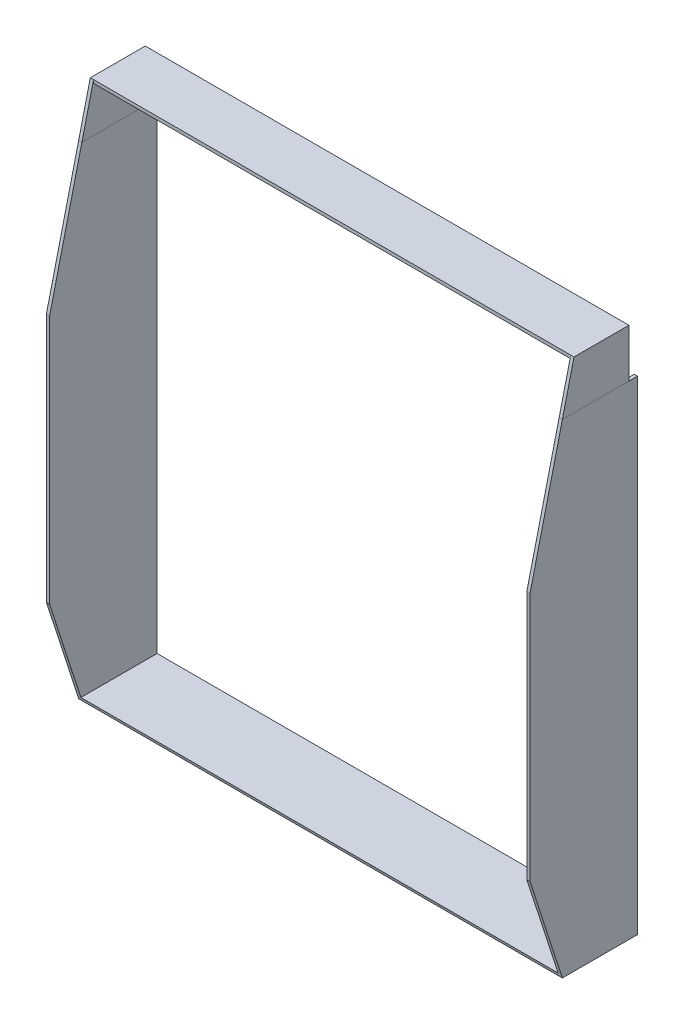
ISO-10303-21;
HEADER;
FILE_DESCRIPTION(('STEP AP214'),'2;1');
FILE_NAME('part.step','',(''),(''),'','','');
FILE_SCHEMA(('AUTOMOTIVE_DESIGN { 1 0 10303 214 1 1 1 1 }'));
ENDSEC;
DATA;
#1=APPLICATION_CONTEXT('core data for automotive mechanical design processes');
#2=APPLICATION_PROTOCOL_DEFINITION('international standard','automotive_design',2000,#1);
#3=PRODUCT_CONTEXT('',#1,'mechanical');
#4=PRODUCT('Part','Part','',(#3));
#5=PRODUCT_RELATED_PRODUCT_CATEGORY('part','',(#4));
#6=PRODUCT_DEFINITION_FORMATION('','',#4);
#7=PRODUCT_DEFINITION_CONTEXT('part definition',#1,'design');
#8=PRODUCT_DEFINITION('design','',#6,#7);
#9=PRODUCT_DEFINITION_SHAPE('','',#8);
#10=(LENGTH_UNIT() NAMED_UNIT(*) SI_UNIT(.MILLI.,.METRE.));
#11=(NAMED_UNIT(*) PLANE_ANGLE_UNIT() SI_UNIT($,.RADIAN.));
#12=(NAMED_UNIT(*) SI_UNIT($,.STERADIAN.) SOLID_ANGLE_UNIT());
#13=UNCERTAINTY_MEASURE_WITH_UNIT(LENGTH_MEASURE(1.E-05),#10,'distance_accuracy_value','');
#14=(GEOMETRIC_REPRESENTATION_CONTEXT(3) GLOBAL_UNCERTAINTY_ASSIGNED_CONTEXT((#13)) GLOBAL_UNIT_ASSIGNED_CONTEXT((#10,
#11,#12)) REPRESENTATION_CONTEXT('',''));
#15=CARTESIAN_POINT('',(0.,0.,0.));
#16=DIRECTION('',(0.,0.,1.));
#17=DIRECTION('',(1.,0.,0.));
#18=AXIS2_PLACEMENT_3D('',#15,#16,#17);
#19=CARTESIAN_POINT('',(-447.3,-2.24999999999983,70.));
#20=DIRECTION('',(0.,0.233726532404869,0.972302374804256));
#21=DIRECTION('',(0.,-0.972302374804256,0.23372653240487));
#22=AXIS2_PLACEMENT_3D('',#19,#20,#21);
#23=PLANE('',#22);
#24=DIRECTION('',(0.,0.972302374804256,-0.23372653240487));
#25=VECTOR('',#24,1.);
#26=CARTESIAN_POINT('',(-450.3,-2.24999999999983,70.));
#27=LINE('',#26,#25);
#28=CARTESIAN_POINT('',(-450.3,-2.24999999999983,70.));
#29=VERTEX_POINT('',#28);
#30=CARTESIAN_POINT('',(-450.3,42.7500000000002,59.1826923076923));
#31=VERTEX_POINT('',#30);
#32=EDGE_CURVE('E162',#29,#31,#27,.T.);
#33=ORIENTED_EDGE('',*,*,#32,.F.);
#34=DIRECTION('',(-1.,0.,0.));
#35=VECTOR('',#34,1.);
#36=CARTESIAN_POINT('',(-447.3,-2.24999999999983,70.));
#37=LINE('',#36,#35);
#38=CARTESIAN_POINT('',(-447.3,-2.24999999999983,70.));
#39=VERTEX_POINT('',#38);
#40=EDGE_CURVE('E12',#39,#29,#37,.T.);
#41=ORIENTED_EDGE('',*,*,#40,.F.);
#42=DIRECTION('',(0.,0.972302374804256,-0.23372653240487));
#43=VECTOR('',#42,1.);
#44=CARTESIAN_POINT('',(-447.3,-2.24999999999983,70.));
#45=LINE('',#44,#43);
#46=CARTESIAN_POINT('',(-447.3,42.7500000000002,59.1826923076923));
#47=VERTEX_POINT('',#46);
#48=EDGE_CURVE('E168',#39,#47,#45,.T.);
#49=ORIENTED_EDGE('',*,*,#48,.T.);
#50=DIRECTION('',(-1.,0.,0.));
#51=VECTOR('',#50,1.);
#52=CARTESIAN_POINT('',(-447.3,42.7500000000002,59.1826923076923));
#53=LINE('',#52,#51);
#54=EDGE_CURVE('E47',#47,#31,#53,.T.);
#55=ORIENTED_EDGE('',*,*,#54,.T.);
#56=EDGE_LOOP('',(#33,#41,#49,#55));
#57=FACE_BOUND('',#56,.T.);
#58=ADVANCED_FACE('F44',(#57),#23,.T.);
#59=CARTESIAN_POINT('',(-447.3,-2.24999999999983,8.00000000000019));
#60=DIRECTION('',(0.,-1.,0.));
#61=DIRECTION('',(0.,0.,-1.));
#62=AXIS2_PLACEMENT_3D('',#59,#60,#61);
#63=PLANE('',#62);
#64=DIRECTION('',(0.,0.,1.));
#65=VECTOR('',#64,1.);
#66=CARTESIAN_POINT('',(-450.3,-2.24999999999983,8.00000000000019));
#67=LINE('',#66,#65);
#68=CARTESIAN_POINT('',(-450.3,-2.24999999999983,8.00000000000019));
#69=VERTEX_POINT('',#68);
#70=EDGE_CURVE('E171',#69,#29,#67,.T.);
#71=ORIENTED_EDGE('',*,*,#70,.F.);
#72=DIRECTION('',(-1.,0.,0.));
#73=VECTOR('',#72,1.);
#74=CARTESIAN_POINT('',(-447.3,-2.24999999999983,8.00000000000019));
#75=LINE('',#74,#73);
#76=CARTESIAN_POINT('',(-447.3,-2.24999999999983,8.00000000000019));
#77=VERTEX_POINT('',#76);
#78=EDGE_CURVE('E53',#77,#69,#75,.T.);
#79=ORIENTED_EDGE('',*,*,#78,.F.);
#80=DIRECTION('',(0.,0.,1.));
#81=VECTOR('',#80,1.);
#82=CARTESIAN_POINT('',(-447.3,-2.24999999999983,8.00000000000019));
#83=LINE('',#82,#81);
#84=EDGE_CURVE('E173',#77,#39,#83,.T.);
#85=ORIENTED_EDGE('',*,*,#84,.T.);
#86=ORIENTED_EDGE('',*,*,#40,.T.);
#87=EDGE_LOOP('',(#71,#79,#85,#86));
#88=FACE_BOUND('',#87,.T.);
#89=ADVANCED_FACE('F187',(#88),#63,.T.);
#90=CARTESIAN_POINT('',(-447.3,42.7500000000002,8.0000000000002));
#91=DIRECTION('',(0.,0.,-1.));
#92=DIRECTION('',(0.,1.,0.));
#93=AXIS2_PLACEMENT_3D('',#90,#91,#92);
#94=PLANE('',#93);
#95=DIRECTION('',(0.,-1.,0.));
#96=VECTOR('',#95,1.);
#97=CARTESIAN_POINT('',(-450.3,42.7500000000002,8.0000000000002));
#98=LINE('',#97,#96);
#99=CARTESIAN_POINT('',(-450.3,42.7500000000002,8.0000000000002));
#100=VERTEX_POINT('',#99);
#101=EDGE_CURVE('E180',#100,#69,#98,.T.);
#102=ORIENTED_EDGE('',*,*,#101,.F.);
#103=DIRECTION('',(-1.,0.,0.));
#104=VECTOR('',#103,1.);
#105=CARTESIAN_POINT('',(-447.3,42.7500000000002,8.0000000000002));
#106=LINE('',#105,#104);
#107=CARTESIAN_POINT('',(0.,42.75,8.00000000000017));
#108=VERTEX_POINT('',#107);
#109=EDGE_CURVE('E184',#108,#100,#106,.T.);
#110=ORIENTED_EDGE('',*,*,#109,.F.);
#111=DIRECTION('',(0.,1.,0.));
#112=VECTOR('',#111,1.);
#113=CARTESIAN_POINT('',(0.,42.75,8.00000000000017));
#114=LINE('',#113,#112);
#115=CARTESIAN_POINT('',(0.,-2.24999999999994,8.00000000000008));
#116=VERTEX_POINT('',#115);
#117=EDGE_CURVE('E204',#116,#108,#114,.T.);
#118=ORIENTED_EDGE('',*,*,#117,.F.);
#119=DIRECTION('',(1.,0.,0.));
#120=VECTOR('',#119,1.);
#121=CARTESIAN_POINT('',(-3.,-2.24999999999994,8.00000000000008));
#122=LINE('',#121,#120);
#123=CARTESIAN_POINT('',(-3.,-2.24999999999994,8.00000000000008));
#124=VERTEX_POINT('',#123);
#125=EDGE_CURVE('E166',#124,#116,#122,.T.);
#126=ORIENTED_EDGE('',*,*,#125,.F.);
#127=DIRECTION('',(0.,1.,0.));
#128=VECTOR('',#127,1.);
#129=CARTESIAN_POINT('',(-3.,42.75,8.00000000000017));
#130=LINE('',#129,#128);
#131=CARTESIAN_POINT('',(-3.,39.7500000000002,8.00000000000016));
#132=VERTEX_POINT('',#131);
#133=EDGE_CURVE('E142',#124,#132,#130,.T.);
#134=ORIENTED_EDGE('',*,*,#133,.T.);
#135=DIRECTION('',(1.,0.,0.));
#136=VECTOR('',#135,1.);
#137=CARTESIAN_POINT('',(-498.570537269117,39.7500000000002,8.00000000000017));
#138=LINE('',#137,#136);
#139=CARTESIAN_POINT('',(-447.3,39.7500000000002,8.00000000000017));
#140=VERTEX_POINT('',#139);
#141=EDGE_CURVE('E159',#140,#132,#138,.T.);
#142=ORIENTED_EDGE('',*,*,#141,.F.);
#143=DIRECTION('',(0.,-1.,0.));
#144=VECTOR('',#143,1.);
#145=CARTESIAN_POINT('',(-447.3,42.7500000000002,8.0000000000002));
#146=LINE('',#145,#144);
#147=EDGE_CURVE('E170',#140,#77,#146,.T.);
#148=ORIENTED_EDGE('',*,*,#147,.T.);
#149=ORIENTED_EDGE('',*,*,#78,.T.);
#150=EDGE_LOOP('',(#102,#110,#118,#126,#134,#142,#148,#149));
#151=FACE_BOUND('',#150,.T.);
#152=ADVANCED_FACE('F196',(#151),#94,.T.);
#153=CARTESIAN_POINT('',(-447.3,42.7500000000002,59.1826923076923));
#154=DIRECTION('',(0.,1.,0.));
#155=DIRECTION('',(0.,0.,1.));
#156=AXIS2_PLACEMENT_3D('',#153,#154,#155);
#157=PLANE('',#156);
#158=DIRECTION('',(0.,0.,-1.));
#159=VECTOR('',#158,1.);
#160=CARTESIAN_POINT('',(-450.3,42.7500000000002,59.1826923076923));
#161=LINE('',#160,#159);
#162=EDGE_CURVE('E177',#31,#100,#161,.T.);
#163=ORIENTED_EDGE('',*,*,#162,.F.);
#164=ORIENTED_EDGE('',*,*,#54,.F.);
#165=DIRECTION('',(1.,0.,0.));
#166=VECTOR('',#165,1.);
#167=CARTESIAN_POINT('',(-498.570537269117,42.7500000000002,59.1826923076923));
#168=LINE('',#167,#166);
#169=CARTESIAN_POINT('',(-3.,42.7500000000002,59.1826923076923));
#170=VERTEX_POINT('',#169);
#171=EDGE_CURVE('E87',#47,#170,#168,.T.);
#172=ORIENTED_EDGE('',*,*,#171,.T.);
#173=DIRECTION('',(1.,0.,0.));
#174=VECTOR('',#173,1.);
#175=CARTESIAN_POINT('',(-3.,42.7500000000002,59.1826923076923));
#176=LINE('',#175,#174);
#177=CARTESIAN_POINT('',(0.,42.7500000000002,59.1826923076923));
#178=VERTEX_POINT('',#177);
#179=EDGE_CURVE('E123',#170,#178,#176,.T.);
#180=ORIENTED_EDGE('',*,*,#179,.T.);
#181=DIRECTION('',(0.,0.,1.));
#182=VECTOR('',#181,1.);
#183=CARTESIAN_POINT('',(0.,42.7500000000002,59.1826923076923));
#184=LINE('',#183,#182);
#185=EDGE_CURVE('E207',#108,#178,#184,.T.);
#186=ORIENTED_EDGE('',*,*,#185,.F.);
#187=ORIENTED_EDGE('',*,*,#109,.T.);
#188=EDGE_LOOP('',(#163,#164,#172,#180,#186,#187));
#189=FACE_BOUND('',#188,.T.);
#190=ADVANCED_FACE('F146',(#189),#157,.T.);
#191=CARTESIAN_POINT('',(-447.3,0.,0.));
#192=DIRECTION('',(-1.,0.,0.));
#193=DIRECTION('',(0.,0.,1.));
#194=AXIS2_PLACEMENT_3D('',#191,#192,#193);
#195=PLANE('',#194);
#196=ORIENTED_EDGE('',*,*,#147,.F.);
#197=DIRECTION('',(0.,0.,1.));
#198=VECTOR('',#197,1.);
#199=CARTESIAN_POINT('',(-447.3,39.7500000000002,8.00000000000017));
#200=LINE('',#199,#198);
#201=CARTESIAN_POINT('',(-447.3,39.7500000000002,59.1826923076923));
#202=VERTEX_POINT('',#201);
#203=EDGE_CURVE('E147',#140,#202,#200,.T.);
#204=ORIENTED_EDGE('',*,*,#203,.T.);
#205=DIRECTION('',(0.,1.,0.));
#206=VECTOR('',#205,1.);
#207=CARTESIAN_POINT('',(-447.3,42.7500000000002,59.1826923076923));
#208=LINE('',#207,#206);
#209=EDGE_CURVE('E160',#202,#47,#208,.T.);
#210=ORIENTED_EDGE('',*,*,#209,.T.);
#211=ORIENTED_EDGE('',*,*,#48,.F.);
#212=ORIENTED_EDGE('',*,*,#84,.F.);
#213=EDGE_LOOP('',(#196,#204,#210,#211,#212));
#214=FACE_BOUND('',#213,.T.);
#215=ADVANCED_FACE('F191',(#214),#195,.F.);
#216=CARTESIAN_POINT('',(-450.3,0.,0.));
#217=DIRECTION('',(-1.,0.,0.));
#218=DIRECTION('',(0.,0.,1.));
#219=AXIS2_PLACEMENT_3D('',#216,#217,#218);
#220=PLANE('',#219);
#221=ORIENTED_EDGE('',*,*,#32,.T.);
#222=ORIENTED_EDGE('',*,*,#162,.T.);
#223=ORIENTED_EDGE('',*,*,#101,.T.);
#224=ORIENTED_EDGE('',*,*,#70,.T.);
#225=EDGE_LOOP('',(#221,#222,#223,#224));
#226=FACE_BOUND('',#225,.T.);
#227=ADVANCED_FACE('F186',(#226),#220,.T.);
#228=CARTESIAN_POINT('',(-498.570537269117,39.7500000000002,8.00000000000017));
#229=DIRECTION('',(0.,1.,0.));
#230=DIRECTION('',(0.,0.,1.));
#231=AXIS2_PLACEMENT_3D('',#228,#229,#230);
#232=PLANE('',#231);
#233=ORIENTED_EDGE('',*,*,#203,.F.);
#234=ORIENTED_EDGE('',*,*,#141,.T.);
#235=DIRECTION('',(0.,0.,1.));
#236=VECTOR('',#235,1.);
#237=CARTESIAN_POINT('',(-3.,39.7500000000002,8.00000000000017));
#238=LINE('',#237,#236);
#239=CARTESIAN_POINT('',(-3.,39.7500000000002,59.1826923076923));
#240=VERTEX_POINT('',#239);
#241=EDGE_CURVE('E154',#132,#240,#238,.T.);
#242=ORIENTED_EDGE('',*,*,#241,.T.);
#243=DIRECTION('',(1.,0.,0.));
#244=VECTOR('',#243,1.);
#245=CARTESIAN_POINT('',(-498.570537269117,39.7500000000002,59.1826923076923));
#246=LINE('',#245,#244);
#247=EDGE_CURVE('E151',#202,#240,#246,.T.);
#248=ORIENTED_EDGE('',*,*,#247,.F.);
#249=EDGE_LOOP('',(#233,#234,#242,#248));
#250=FACE_BOUND('',#249,.T.);
#251=ADVANCED_FACE('F193',(#250),#232,.F.);
#252=CARTESIAN_POINT('',(-498.570537269117,42.7500000000002,59.1826923076923));
#253=DIRECTION('',(0.,0.,-1.));
#254=DIRECTION('',(-1.,0.,0.));
#255=AXIS2_PLACEMENT_3D('',#252,#253,#254);
#256=PLANE('',#255);
#257=ORIENTED_EDGE('',*,*,#209,.F.);
#258=ORIENTED_EDGE('',*,*,#247,.T.);
#259=DIRECTION('',(0.,1.,0.));
#260=VECTOR('',#259,1.);
#261=CARTESIAN_POINT('',(-3.,42.7500000000002,59.1826923076923));
#262=LINE('',#261,#260);
#263=EDGE_CURVE('E138',#240,#170,#262,.T.);
#264=ORIENTED_EDGE('',*,*,#263,.T.);
#265=ORIENTED_EDGE('',*,*,#171,.F.);
#266=EDGE_LOOP('',(#257,#258,#264,#265));
#267=FACE_BOUND('',#266,.T.);
#268=ADVANCED_FACE('F149',(#267),#256,.F.);
#269=CARTESIAN_POINT('',(-3.,0.,0.));
#270=DIRECTION('',(-1.,0.,0.));
#271=DIRECTION('',(0.,0.,1.));
#272=AXIS2_PLACEMENT_3D('',#269,#270,#271);
#273=PLANE('',#272);
#274=ORIENTED_EDGE('',*,*,#263,.F.);
#275=ORIENTED_EDGE('',*,*,#241,.F.);
#276=ORIENTED_EDGE('',*,*,#133,.F.);
#277=DIRECTION('',(0.,0.,-1.));
#278=VECTOR('',#277,1.);
#279=CARTESIAN_POINT('',(-3.,-2.24999999999994,8.00000000000008));
#280=LINE('',#279,#278);
#281=CARTESIAN_POINT('',(-3.,-2.24999999999983,70.));
#282=VERTEX_POINT('',#281);
#283=EDGE_CURVE('E134',#282,#124,#280,.T.);
#284=ORIENTED_EDGE('',*,*,#283,.F.);
#285=DIRECTION('',(0.,-0.972302374804256,0.23372653240487));
#286=VECTOR('',#285,1.);
#287=CARTESIAN_POINT('',(-3.,-2.24999999999983,70.));
#288=LINE('',#287,#286);
#289=EDGE_CURVE('E126',#170,#282,#288,.T.);
#290=ORIENTED_EDGE('',*,*,#289,.F.);
#291=EDGE_LOOP('',(#274,#275,#276,#284,#290));
#292=FACE_BOUND('',#291,.T.);
#293=ADVANCED_FACE('F137',(#292),#273,.T.);
#294=CARTESIAN_POINT('',(-3.,-2.24999999999994,8.00000000000008));
#295=DIRECTION('',(0.,-1.,0.));
#296=DIRECTION('',(0.,0.,-1.));
#297=AXIS2_PLACEMENT_3D('',#294,#295,#296);
#298=PLANE('',#297);
#299=DIRECTION('',(0.,0.,-1.));
#300=VECTOR('',#299,1.);
#301=CARTESIAN_POINT('',(0.,-2.24999999999994,8.00000000000008));
#302=LINE('',#301,#300);
#303=CARTESIAN_POINT('',(0.,-2.24999999999983,70.));
#304=VERTEX_POINT('',#303);
#305=EDGE_CURVE('E198',#304,#116,#302,.T.);
#306=ORIENTED_EDGE('',*,*,#305,.F.);
#307=DIRECTION('',(1.,0.,0.));
#308=VECTOR('',#307,1.);
#309=CARTESIAN_POINT('',(-3.,-2.24999999999983,70.));
#310=LINE('',#309,#308);
#311=EDGE_CURVE('E133',#282,#304,#310,.T.);
#312=ORIENTED_EDGE('',*,*,#311,.F.);
#313=ORIENTED_EDGE('',*,*,#283,.T.);
#314=ORIENTED_EDGE('',*,*,#125,.T.);
#315=EDGE_LOOP('',(#306,#312,#313,#314));
#316=FACE_BOUND('',#315,.T.);
#317=ADVANCED_FACE('F214',(#316),#298,.T.);
#318=CARTESIAN_POINT('',(-3.,-2.24999999999983,70.));
#319=DIRECTION('',(0.,0.233726532404869,0.972302374804256));
#320=DIRECTION('',(0.,-0.972302374804256,0.23372653240487));
#321=AXIS2_PLACEMENT_3D('',#318,#319,#320);
#322=PLANE('',#321);
#323=DIRECTION('',(0.,-0.972302374804256,0.23372653240487));
#324=VECTOR('',#323,1.);
#325=CARTESIAN_POINT('',(0.,-2.24999999999983,70.));
#326=LINE('',#325,#324);
#327=EDGE_CURVE('E129',#178,#304,#326,.T.);
#328=ORIENTED_EDGE('',*,*,#327,.F.);
#329=ORIENTED_EDGE('',*,*,#179,.F.);
#330=ORIENTED_EDGE('',*,*,#289,.T.);
#331=ORIENTED_EDGE('',*,*,#311,.T.);
#332=EDGE_LOOP('',(#328,#329,#330,#331));
#333=FACE_BOUND('',#332,.T.);
#334=ADVANCED_FACE('F125',(#333),#322,.T.);
#335=CARTESIAN_POINT('',(0.,0.,0.));
#336=DIRECTION('',(-1.,0.,0.));
#337=DIRECTION('',(0.,0.,1.));
#338=AXIS2_PLACEMENT_3D('',#335,#336,#337);
#339=PLANE('',#338);
#340=ORIENTED_EDGE('',*,*,#117,.T.);
#341=ORIENTED_EDGE('',*,*,#185,.T.);
#342=ORIENTED_EDGE('',*,*,#327,.T.);
#343=ORIENTED_EDGE('',*,*,#305,.T.);
#344=EDGE_LOOP('',(#340,#341,#342,#343));
#345=FACE_BOUND('',#344,.T.);
#346=ADVANCED_FACE('F213',(#345),#339,.F.);
#347=CLOSED_SHELL('',(#58,#89,#152,#190,#215,#227,#251,#268,#293,#317,#334,#346));
#348=MANIFOLD_SOLID_BREP('B2',#347);
#349=CARTESIAN_POINT('',(0.,0.,100.));
#350=DIRECTION('',(0.,0.,1.));
#351=DIRECTION('',(1.,0.,0.));
#352=AXIS2_PLACEMENT_3D('',#349,#350,#351);
#353=PLANE('',#352);
#354=DIRECTION('',(-1.,0.,0.));
#355=VECTOR('',#354,1.);
#356=CARTESIAN_POINT('',(0.,-359.902941176471,100.));
#357=LINE('',#356,#355);
#358=CARTESIAN_POINT('',(0.,-359.902941176471,100.));
#359=VERTEX_POINT('',#358);
#360=CARTESIAN_POINT('',(-3.00000000000011,-359.902941176471,100.));
#361=VERTEX_POINT('',#360);
#362=EDGE_CURVE('E42',#359,#361,#357,.T.);
#363=ORIENTED_EDGE('',*,*,#362,.F.);
#364=DIRECTION('',(0.,1.,0.));
#365=VECTOR('',#364,1.);
#366=CARTESIAN_POINT('',(-1.11022302462516E-13,-2.24999999999983,100.));
#367=LINE('',#366,#365);
#368=CARTESIAN_POINT('',(0.,-127.05,100.));
#369=VERTEX_POINT('',#368);
#370=EDGE_CURVE('E429',#359,#369,#367,.T.);
#371=ORIENTED_EDGE('',*,*,#370,.T.);
#372=DIRECTION('',(1.,0.,0.));
#373=VECTOR('',#372,1.);
#374=CARTESIAN_POINT('',(0.,-127.05,100.));
#375=LINE('',#374,#373);
#376=CARTESIAN_POINT('',(-3.00000000000011,-127.05,100.));
#377=VERTEX_POINT('',#376);
#378=EDGE_CURVE('E439',#377,#369,#375,.T.);
#379=ORIENTED_EDGE('',*,*,#378,.F.);
#380=DIRECTION('',(0.,-1.,0.));
#381=VECTOR('',#380,1.);
#382=CARTESIAN_POINT('',(-3.00000000000011,-5.24999999999983,100.));
#383=LINE('',#382,#381);
#384=EDGE_CURVE('E463',#377,#361,#383,.T.);
#385=ORIENTED_EDGE('',*,*,#384,.T.);
#386=EDGE_LOOP('',(#363,#371,#379,#385));
#387=FACE_BOUND('',#386,.T.);
#388=ADVANCED_FACE('F323',(#387),#353,.T.);
#389=CARTESIAN_POINT('',(-450.3,-2.24999999999983,100.));
#390=DIRECTION('',(1.,0.,0.));
#391=DIRECTION('',(0.,0.,-1.));
#392=AXIS2_PLACEMENT_3D('',#389,#390,#391);
#393=PLANE('',#392);
#394=DIRECTION('',(0.,0.,-1.));
#395=VECTOR('',#394,1.);
#396=CARTESIAN_POINT('',(-450.3,-452.55,100.));
#397=LINE('',#396,#395);
#398=CARTESIAN_POINT('',(-450.3,-452.55,70.));
#399=VERTEX_POINT('',#398);
#400=CARTESIAN_POINT('',(-450.3,-452.55,0.));
#401=VERTEX_POINT('',#400);
#402=EDGE_CURVE('E436',#399,#401,#397,.T.);
#403=ORIENTED_EDGE('',*,*,#402,.F.);
#404=DIRECTION('',(0.,0.951366440234242,0.308061513980612));
#405=VECTOR('',#404,1.);
#406=CARTESIAN_POINT('',(-450.3,-36.1919423692635,204.820704375667));
#407=LINE('',#406,#405);
#408=CARTESIAN_POINT('',(-450.3,-359.902941176471,100.));
#409=VERTEX_POINT('',#408);
#410=EDGE_CURVE('E415',#399,#409,#407,.T.);
#411=ORIENTED_EDGE('',*,*,#410,.T.);
#412=DIRECTION('',(0.,-1.,0.));
#413=VECTOR('',#412,1.);
#414=CARTESIAN_POINT('',(-450.3,-2.24999999999983,100.));
#415=LINE('',#414,#413);
#416=CARTESIAN_POINT('',(-450.3,-127.05,100.));
#417=VERTEX_POINT('',#416);
#418=EDGE_CURVE('E455',#417,#409,#415,.T.);
#419=ORIENTED_EDGE('',*,*,#418,.F.);
#420=DIRECTION('',(0.,0.972302374804256,-0.23372653240487));
#421=VECTOR('',#420,1.);
#422=CARTESIAN_POINT('',(-450.3,-9.06758587536038,71.6388427585001));
#423=LINE('',#422,#421);
#424=CARTESIAN_POINT('',(-450.3,-2.24999999999983,70.));
#425=VERTEX_POINT('',#424);
#426=EDGE_CURVE('E515',#417,#425,#423,.T.);
#427=ORIENTED_EDGE('',*,*,#426,.T.);
#428=DIRECTION('',(0.,0.,-1.));
#429=VECTOR('',#428,1.);
#430=CARTESIAN_POINT('',(-450.3,-2.24999999999983,100.));
#431=LINE('',#430,#429);
#432=CARTESIAN_POINT('',(-450.3,-2.24999999999983,0.));
#433=VERTEX_POINT('',#432);
#434=EDGE_CURVE('E474',#425,#433,#431,.T.);
#435=ORIENTED_EDGE('',*,*,#434,.T.);
#436=DIRECTION('',(0.,-1.,0.));
#437=VECTOR('',#436,1.);
#438=CARTESIAN_POINT('',(-450.3,-2.24999999999983,0.));
#439=LINE('',#438,#437);
#440=EDGE_CURVE('E457',#433,#401,#439,.T.);
#441=ORIENTED_EDGE('',*,*,#440,.T.);
#442=EDGE_LOOP('',(#403,#411,#419,#427,#435,#441));
#443=FACE_BOUND('',#442,.T.);
#444=ADVANCED_FACE('F325',(#443),#393,.F.);
#445=CARTESIAN_POINT('',(-450.3,-452.55,100.));
#446=DIRECTION('',(0.,1.,0.));
#447=DIRECTION('',(0.,0.,1.));
#448=AXIS2_PLACEMENT_3D('',#445,#446,#447);
#449=PLANE('',#448);
#450=DIRECTION('',(0.,0.,-1.));
#451=VECTOR('',#450,1.);
#452=CARTESIAN_POINT('',(-1.11022302462516E-13,-452.55,100.));
#453=LINE('',#452,#451);
#454=CARTESIAN_POINT('',(0.,-452.55,70.));
#455=VERTEX_POINT('',#454);
#456=CARTESIAN_POINT('',(-1.11022302462516E-13,-452.55,0.));
#457=VERTEX_POINT('',#456);
#458=EDGE_CURVE('E425',#455,#457,#453,.T.);
#459=ORIENTED_EDGE('',*,*,#458,.F.);
#460=DIRECTION('',(1.,0.,0.));
#461=VECTOR('',#460,1.);
#462=CARTESIAN_POINT('',(-496.,-452.55,70.));
#463=LINE('',#462,#461);
#464=EDGE_CURVE('E409',#399,#455,#463,.T.);
#465=ORIENTED_EDGE('',*,*,#464,.F.);
#466=ORIENTED_EDGE('',*,*,#402,.T.);
#467=DIRECTION('',(1.,0.,0.));
#468=VECTOR('',#467,1.);
#469=CARTESIAN_POINT('',(-450.3,-452.55,0.));
#470=LINE('',#469,#468);
#471=EDGE_CURVE('E434',#401,#457,#470,.T.);
#472=ORIENTED_EDGE('',*,*,#471,.T.);
#473=EDGE_LOOP('',(#459,#465,#466,#472));
#474=FACE_BOUND('',#473,.T.);
#475=ADVANCED_FACE('F432',(#474),#449,.F.);
#476=CARTESIAN_POINT('',(-1.11022302462516E-13,-2.24999999999983,100.));
#477=DIRECTION('',(-1.,0.,0.));
#478=DIRECTION('',(0.,0.,1.));
#479=AXIS2_PLACEMENT_3D('',#476,#477,#478);
#480=PLANE('',#479);
#481=ORIENTED_EDGE('',*,*,#370,.F.);
#482=DIRECTION('',(0.,0.951366440234242,0.308061513980612));
#483=VECTOR('',#482,1.);
#484=CARTESIAN_POINT('',(0.,-452.55,70.));
#485=LINE('',#484,#483);
#486=EDGE_CURVE('E412',#455,#359,#485,.T.);
#487=ORIENTED_EDGE('',*,*,#486,.F.);
#488=ORIENTED_EDGE('',*,*,#458,.T.);
#489=DIRECTION('',(0.,1.,0.));
#490=VECTOR('',#489,1.);
#491=CARTESIAN_POINT('',(-1.11022302462516E-13,-2.24999999999983,0.));
#492=LINE('',#491,#490);
#493=CARTESIAN_POINT('',(-1.11022302462516E-13,-2.24999999999983,0.));
#494=VERTEX_POINT('',#493);
#495=EDGE_CURVE('E477',#457,#494,#492,.T.);
#496=ORIENTED_EDGE('',*,*,#495,.T.);
#497=DIRECTION('',(0.,0.,-1.));
#498=VECTOR('',#497,1.);
#499=CARTESIAN_POINT('',(-1.11022302462516E-13,-2.24999999999983,100.));
#500=LINE('',#499,#498);
#501=CARTESIAN_POINT('',(0.,-2.24999999999983,70.));
#502=VERTEX_POINT('',#501);
#503=EDGE_CURVE('E437',#502,#494,#500,.T.);
#504=ORIENTED_EDGE('',*,*,#503,.F.);
#505=DIRECTION('',(0.,0.972302374804256,-0.233726532404869));
#506=VECTOR('',#505,1.);
#507=CARTESIAN_POINT('',(0.,-127.05,100.));
#508=LINE('',#507,#506);
#509=EDGE_CURVE('E661',#369,#502,#508,.T.);
#510=ORIENTED_EDGE('',*,*,#509,.F.);
#511=EDGE_LOOP('',(#481,#487,#488,#496,#504,#510));
#512=FACE_BOUND('',#511,.T.);
#513=ADVANCED_FACE('F423',(#512),#480,.F.);
#514=CARTESIAN_POINT('',(-3.00000000000011,-2.24999999999983,100.));
#515=DIRECTION('',(0.,-1.,0.));
#516=DIRECTION('',(0.,0.,-1.));
#517=AXIS2_PLACEMENT_3D('',#514,#515,#516);
#518=PLANE('',#517);
#519=DIRECTION('',(0.,0.,-1.));
#520=VECTOR('',#519,1.);
#521=CARTESIAN_POINT('',(-3.00000000000011,-2.24999999999983,100.));
#522=LINE('',#521,#520);
#523=CARTESIAN_POINT('',(-3.00000000000011,-2.24999999999983,70.));
#524=VERTEX_POINT('',#523);
#525=CARTESIAN_POINT('',(-3.00000000000011,-2.24999999999983,0.));
#526=VERTEX_POINT('',#525);
#527=EDGE_CURVE('E441',#524,#526,#522,.T.);
#528=ORIENTED_EDGE('',*,*,#527,.F.);
#529=DIRECTION('',(1.,0.,0.));
#530=VECTOR('',#529,1.);
#531=CARTESIAN_POINT('',(-496.,-2.24999999999983,70.));
#532=LINE('',#531,#530);
#533=EDGE_CURVE('E512',#524,#502,#532,.T.);
#534=ORIENTED_EDGE('',*,*,#533,.T.);
#535=ORIENTED_EDGE('',*,*,#503,.T.);
#536=DIRECTION('',(-1.,0.,0.));
#537=VECTOR('',#536,1.);
#538=CARTESIAN_POINT('',(-3.00000000000011,-2.24999999999983,0.));
#539=LINE('',#538,#537);
#540=EDGE_CURVE('E479',#494,#526,#539,.T.);
#541=ORIENTED_EDGE('',*,*,#540,.T.);
#542=EDGE_LOOP('',(#528,#534,#535,#541));
#543=FACE_BOUND('',#542,.T.);
#544=ADVANCED_FACE('F510',(#543),#518,.F.);
#545=CARTESIAN_POINT('',(-3.00000000000011,-5.24999999999983,100.));
#546=DIRECTION('',(1.,0.,0.));
#547=DIRECTION('',(0.,1.,0.));
#548=AXIS2_PLACEMENT_3D('',#545,#546,#547);
#549=PLANE('',#548);
#550=DIRECTION('',(0.,0.,-1.));
#551=VECTOR('',#550,1.);
#552=CARTESIAN_POINT('',(-3.00000000000011,-449.55,100.));
#553=LINE('',#552,#551);
#554=CARTESIAN_POINT('',(-3.00000000000006,-449.55,70.9714285714286));
#555=VERTEX_POINT('',#554);
#556=CARTESIAN_POINT('',(-3.00000000000011,-449.55,0.));
#557=VERTEX_POINT('',#556);
#558=EDGE_CURVE('E495',#555,#557,#553,.T.);
#559=ORIENTED_EDGE('',*,*,#558,.F.);
#560=DIRECTION('',(0.,0.951366440234242,0.308061513980612));
#561=VECTOR('',#560,1.);
#562=CARTESIAN_POINT('',(-3.00000000000011,-38.9072366800754,203.94146621788));
#563=LINE('',#562,#561);
#564=EDGE_CURVE('E458',#555,#361,#563,.T.);
#565=ORIENTED_EDGE('',*,*,#564,.T.);
#566=ORIENTED_EDGE('',*,*,#384,.F.);
#567=DIRECTION('',(0.,0.972302374804256,-0.23372653240487));
#568=VECTOR('',#567,1.);
#569=CARTESIAN_POINT('',(-3.00000000000011,-11.9037015995104,72.3206013460362));
#570=LINE('',#569,#568);
#571=EDGE_CURVE('E346',#377,#524,#570,.T.);
#572=ORIENTED_EDGE('',*,*,#571,.T.);
#573=ORIENTED_EDGE('',*,*,#527,.T.);
#574=DIRECTION('',(0.,-1.,0.));
#575=VECTOR('',#574,1.);
#576=CARTESIAN_POINT('',(-3.00000000000011,-5.24999999999983,0.));
#577=LINE('',#576,#575);
#578=EDGE_CURVE('E482',#526,#557,#577,.T.);
#579=ORIENTED_EDGE('',*,*,#578,.T.);
#580=EDGE_LOOP('',(#559,#565,#566,#572,#573,#579));
#581=FACE_BOUND('',#580,.T.);
#582=ADVANCED_FACE('F500',(#581),#549,.F.);
#583=CARTESIAN_POINT('',(-447.3,-449.55,100.));
#584=DIRECTION('',(0.,-1.,0.));
#585=DIRECTION('',(0.,0.,-1.));
#586=AXIS2_PLACEMENT_3D('',#583,#584,#585);
#587=PLANE('',#586);
#588=DIRECTION('',(0.,0.,-1.));
#589=VECTOR('',#588,1.);
#590=CARTESIAN_POINT('',(-447.3,-449.55,100.));
#591=LINE('',#590,#589);
#592=CARTESIAN_POINT('',(-447.3,-449.55,70.9714285714286));
#593=VERTEX_POINT('',#592);
#594=CARTESIAN_POINT('',(-447.3,-449.55,0.));
#595=VERTEX_POINT('',#594);
#596=EDGE_CURVE('E493',#593,#595,#591,.T.);
#597=ORIENTED_EDGE('',*,*,#596,.F.);
#598=DIRECTION('',(1.,0.,0.));
#599=VECTOR('',#598,1.);
#600=CARTESIAN_POINT('',(-447.3,-449.55,70.9714285714286));
#601=LINE('',#600,#599);
#602=EDGE_CURVE('E525',#593,#555,#601,.T.);
#603=ORIENTED_EDGE('',*,*,#602,.T.);
#604=ORIENTED_EDGE('',*,*,#558,.T.);
#605=DIRECTION('',(-1.,0.,0.));
#606=VECTOR('',#605,1.);
#607=CARTESIAN_POINT('',(-447.3,-449.55,0.));
#608=LINE('',#607,#606);
#609=EDGE_CURVE('E485',#557,#595,#608,.T.);
#610=ORIENTED_EDGE('',*,*,#609,.T.);
#611=EDGE_LOOP('',(#597,#603,#604,#610));
#612=FACE_BOUND('',#611,.T.);
#613=ADVANCED_FACE('F523',(#612),#587,.F.);
#614=CARTESIAN_POINT('',(-447.3,-5.24999999999983,100.));
#615=DIRECTION('',(-1.,0.,0.));
#616=DIRECTION('',(0.,0.,1.));
#617=AXIS2_PLACEMENT_3D('',#614,#615,#616);
#618=PLANE('',#617);
#619=DIRECTION('',(0.,1.,0.));
#620=VECTOR('',#619,1.);
#621=CARTESIAN_POINT('',(-447.3,-5.24999999999983,100.));
#622=LINE('',#621,#620);
#623=CARTESIAN_POINT('',(-447.3,-359.902941176471,100.));
#624=VERTEX_POINT('',#623);
#625=CARTESIAN_POINT('',(-447.3,-127.05,100.));
#626=VERTEX_POINT('',#625);
#627=EDGE_CURVE('E472',#624,#626,#622,.T.);
#628=ORIENTED_EDGE('',*,*,#627,.F.);
#629=DIRECTION('',(0.,-0.951366440234242,-0.308061513980612));
#630=VECTOR('',#629,1.);
#631=CARTESIAN_POINT('',(-447.3,-38.9072366800754,203.94146621788));
#632=LINE('',#631,#630);
#633=EDGE_CURVE('E338',#624,#593,#632,.T.);
#634=ORIENTED_EDGE('',*,*,#633,.T.);
#635=ORIENTED_EDGE('',*,*,#596,.T.);
#636=DIRECTION('',(0.,1.,0.));
#637=VECTOR('',#636,1.);
#638=CARTESIAN_POINT('',(-447.3,-5.24999999999983,0.));
#639=LINE('',#638,#637);
#640=CARTESIAN_POINT('',(-447.3,-2.24999999999983,0.));
#641=VERTEX_POINT('',#640);
#642=EDGE_CURVE('E466',#595,#641,#639,.T.);
#643=ORIENTED_EDGE('',*,*,#642,.T.);
#644=DIRECTION('',(0.,0.,-1.));
#645=VECTOR('',#644,1.);
#646=CARTESIAN_POINT('',(-447.3,-2.24999999999983,100.));
#647=LINE('',#646,#645);
#648=CARTESIAN_POINT('',(-447.3,-2.24999999999983,70.));
#649=VERTEX_POINT('',#648);
#650=EDGE_CURVE('E491',#649,#641,#647,.T.);
#651=ORIENTED_EDGE('',*,*,#650,.F.);
#652=DIRECTION('',(0.,-0.972302374804256,0.23372653240487));
#653=VECTOR('',#652,1.);
#654=CARTESIAN_POINT('',(-447.3,-11.9037015995104,72.3206013460362));
#655=LINE('',#654,#653);
#656=EDGE_CURVE('E419',#649,#626,#655,.T.);
#657=ORIENTED_EDGE('',*,*,#656,.T.);
#658=EDGE_LOOP('',(#628,#634,#635,#643,#651,#657));
#659=FACE_BOUND('',#658,.T.);
#660=ADVANCED_FACE('F541',(#659),#618,.F.);
#661=CARTESIAN_POINT('',(-450.3,-2.24999999999983,100.));
#662=DIRECTION('',(0.,-1.,0.));
#663=DIRECTION('',(0.,0.,-1.));
#664=AXIS2_PLACEMENT_3D('',#661,#662,#663);
#665=PLANE('',#664);
#666=ORIENTED_EDGE('',*,*,#434,.F.);
#667=EDGE_CURVE('E430',#425,#649,#532,.T.);
#668=ORIENTED_EDGE('',*,*,#667,.T.);
#669=ORIENTED_EDGE('',*,*,#650,.T.);
#670=DIRECTION('',(-1.,0.,0.));
#671=VECTOR('',#670,1.);
#672=CARTESIAN_POINT('',(-450.3,-2.24999999999983,0.));
#673=LINE('',#672,#671);
#674=EDGE_CURVE('E461',#641,#433,#673,.T.);
#675=ORIENTED_EDGE('',*,*,#674,.T.);
#676=EDGE_LOOP('',(#666,#668,#669,#675));
#677=FACE_BOUND('',#676,.T.);
#678=ADVANCED_FACE('F518',(#677),#665,.F.);
#679=EDGE_CURVE('E327',#624,#409,#357,.T.);
#680=ORIENTED_EDGE('',*,*,#679,.F.);
#681=ORIENTED_EDGE('',*,*,#627,.T.);
#682=EDGE_CURVE('E444',#417,#626,#375,.T.);
#683=ORIENTED_EDGE('',*,*,#682,.F.);
#684=ORIENTED_EDGE('',*,*,#418,.T.);
#685=EDGE_LOOP('',(#680,#681,#683,#684));
#686=FACE_BOUND('',#685,.T.);
#687=ADVANCED_FACE('F460',(#686),#353,.T.);
#688=CARTESIAN_POINT('',(0.,0.,0.));
#689=DIRECTION('',(0.,0.,1.));
#690=DIRECTION('',(1.,0.,0.));
#691=AXIS2_PLACEMENT_3D('',#688,#689,#690);
#692=PLANE('',#691);
#693=ORIENTED_EDGE('',*,*,#440,.F.);
#694=ORIENTED_EDGE('',*,*,#674,.F.);
#695=ORIENTED_EDGE('',*,*,#642,.F.);
#696=ORIENTED_EDGE('',*,*,#609,.F.);
#697=ORIENTED_EDGE('',*,*,#578,.F.);
#698=ORIENTED_EDGE('',*,*,#540,.F.);
#699=ORIENTED_EDGE('',*,*,#495,.F.);
#700=ORIENTED_EDGE('',*,*,#471,.F.);
#701=EDGE_LOOP('',(#693,#694,#695,#696,#697,#698,#699,#700));
#702=FACE_BOUND('',#701,.T.);
#703=ADVANCED_FACE('F508',(#702),#692,.F.);
#704=CARTESIAN_POINT('',(-496.,-127.05,100.));
#705=DIRECTION('',(0.,-0.233726532404869,-0.972302374804256));
#706=DIRECTION('',(0.,0.972302374804256,-0.233726532404869));
#707=AXIS2_PLACEMENT_3D('',#704,#705,#706);
#708=PLANE('',#707);
#709=ORIENTED_EDGE('',*,*,#378,.T.);
#710=ORIENTED_EDGE('',*,*,#509,.T.);
#711=ORIENTED_EDGE('',*,*,#533,.F.);
#712=ORIENTED_EDGE('',*,*,#571,.F.);
#713=EDGE_LOOP('',(#709,#710,#711,#712));
#714=FACE_BOUND('',#713,.T.);
#715=ADVANCED_FACE('F540',(#714),#708,.F.);
#716=ORIENTED_EDGE('',*,*,#682,.T.);
#717=ORIENTED_EDGE('',*,*,#656,.F.);
#718=ORIENTED_EDGE('',*,*,#667,.F.);
#719=ORIENTED_EDGE('',*,*,#426,.F.);
#720=EDGE_LOOP('',(#716,#717,#718,#719));
#721=FACE_BOUND('',#720,.T.);
#722=ADVANCED_FACE('F600',(#721),#708,.F.);
#723=CARTESIAN_POINT('',(-496.,-452.55,70.));
#724=DIRECTION('',(0.,0.308061513980612,-0.951366440234242));
#725=DIRECTION('',(0.,0.951366440234242,0.308061513980612));
#726=AXIS2_PLACEMENT_3D('',#723,#724,#725);
#727=PLANE('',#726);
#728=ORIENTED_EDGE('',*,*,#464,.T.);
#729=ORIENTED_EDGE('',*,*,#486,.T.);
#730=ORIENTED_EDGE('',*,*,#362,.T.);
#731=ORIENTED_EDGE('',*,*,#564,.F.);
#732=ORIENTED_EDGE('',*,*,#602,.F.);
#733=ORIENTED_EDGE('',*,*,#633,.F.);
#734=ORIENTED_EDGE('',*,*,#679,.T.);
#735=ORIENTED_EDGE('',*,*,#410,.F.);
#736=EDGE_LOOP('',(#728,#729,#730,#731,#732,#733,#734,#735));
#737=FACE_BOUND('',#736,.T.);
#738=ADVANCED_FACE('F411',(#737),#727,.F.);
#739=CLOSED_SHELL('',(#388,#444,#475,#513,#544,#582,#613,#660,#678,#687,#703,#715,#722,#738));
#740=MANIFOLD_SOLID_BREP('B6',#739);
#741=ADVANCED_BREP_SHAPE_REPRESENTATION('',(#18,#348,#740),#14);
#742=SHAPE_DEFINITION_REPRESENTATION(#9,#741);
ENDSEC;
END-ISO-10303-21;
